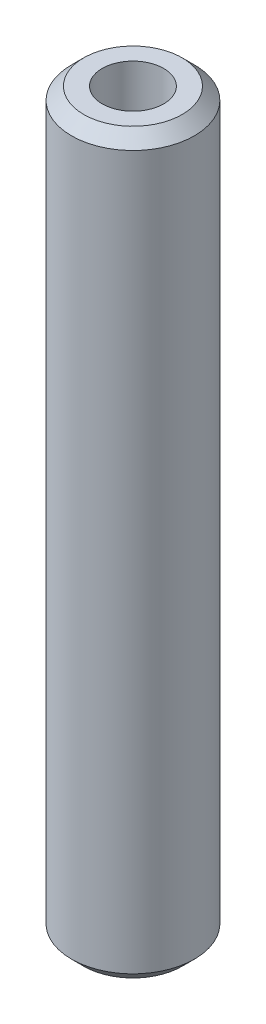
ISO-10303-21;
HEADER;
FILE_DESCRIPTION(('STEP AP214'),'2;1');
FILE_NAME('part.step','',(''),(''),'','','');
FILE_SCHEMA(('AUTOMOTIVE_DESIGN { 1 0 10303 214 1 1 1 1 }'));
ENDSEC;
DATA;
#1=APPLICATION_CONTEXT('core data for automotive mechanical design processes');
#2=APPLICATION_PROTOCOL_DEFINITION('international standard','automotive_design',2000,#1);
#3=PRODUCT_CONTEXT('',#1,'mechanical');
#4=PRODUCT('Part','Part','',(#3));
#5=PRODUCT_RELATED_PRODUCT_CATEGORY('part','',(#4));
#6=PRODUCT_DEFINITION_FORMATION('','',#4);
#7=PRODUCT_DEFINITION_CONTEXT('part definition',#1,'design');
#8=PRODUCT_DEFINITION('design','',#6,#7);
#9=PRODUCT_DEFINITION_SHAPE('','',#8);
#10=(LENGTH_UNIT() NAMED_UNIT(*) SI_UNIT(.MILLI.,.METRE.));
#11=(NAMED_UNIT(*) PLANE_ANGLE_UNIT() SI_UNIT($,.RADIAN.));
#12=(NAMED_UNIT(*) SI_UNIT($,.STERADIAN.) SOLID_ANGLE_UNIT());
#13=UNCERTAINTY_MEASURE_WITH_UNIT(LENGTH_MEASURE(1.E-05),#10,'distance_accuracy_value','');
#14=(GEOMETRIC_REPRESENTATION_CONTEXT(3) GLOBAL_UNCERTAINTY_ASSIGNED_CONTEXT((#13)) GLOBAL_UNIT_ASSIGNED_CONTEXT((#10,
#11,#12)) REPRESENTATION_CONTEXT('',''));
#15=CARTESIAN_POINT('',(0.,0.,0.));
#16=DIRECTION('',(0.,0.,1.));
#17=DIRECTION('',(1.,0.,0.));
#18=AXIS2_PLACEMENT_3D('',#15,#16,#17);
#19=CARTESIAN_POINT('',(0.,30.,0.));
#20=DIRECTION('',(0.,-1.,0.));
#21=DIRECTION('',(0.,0.,-1.));
#22=AXIS2_PLACEMENT_3D('',#19,#20,#21);
#23=CYLINDRICAL_SURFACE('',#22,2.5);
#24=CARTESIAN_POINT('',(0.,0.500000000000007,0.));
#25=DIRECTION('',(0.,1.,0.));
#26=DIRECTION('',(0.,0.,1.));
#27=AXIS2_PLACEMENT_3D('',#24,#25,#26);
#28=CIRCLE('',#27,2.5);
#29=CARTESIAN_POINT('',(0.,0.500000000000007,2.5));
#30=VERTEX_POINT('',#29);
#31=EDGE_CURVE('E92',#30,#30,#28,.T.);
#32=ORIENTED_EDGE('',*,*,#31,.T.);
#33=EDGE_LOOP('',(#32));
#34=FACE_BOUND('',#33,.T.);
#35=CARTESIAN_POINT('',(0.,29.5,0.));
#36=DIRECTION('',(0.,1.,0.));
#37=DIRECTION('',(0.,0.,1.));
#38=AXIS2_PLACEMENT_3D('',#35,#36,#37);
#39=CIRCLE('',#38,2.5);
#40=CARTESIAN_POINT('',(0.,29.5,2.5));
#41=VERTEX_POINT('',#40);
#42=EDGE_CURVE('E88',#41,#41,#39,.F.);
#43=ORIENTED_EDGE('',*,*,#42,.T.);
#44=EDGE_LOOP('',(#43));
#45=FACE_BOUND('',#44,.T.);
#46=ADVANCED_FACE('F47',(#34,#45),#23,.T.);
#47=CARTESIAN_POINT('',(0.,30.,0.));
#48=DIRECTION('',(0.,1.,0.));
#49=DIRECTION('',(0.,0.,1.));
#50=AXIS2_PLACEMENT_3D('',#47,#48,#49);
#51=PLANE('',#50);
#52=CARTESIAN_POINT('',(0.,30.,0.));
#53=DIRECTION('',(0.,1.,0.));
#54=DIRECTION('',(0.,0.,1.));
#55=AXIS2_PLACEMENT_3D('',#52,#53,#54);
#56=CIRCLE('',#55,1.99999999999999);
#57=CARTESIAN_POINT('',(0.,30.,1.99999999999999));
#58=VERTEX_POINT('',#57);
#59=EDGE_CURVE('E11',#58,#58,#56,.T.);
#60=ORIENTED_EDGE('',*,*,#59,.T.);
#61=EDGE_LOOP('',(#60));
#62=FACE_BOUND('',#61,.T.);
#63=CARTESIAN_POINT('',(0.,30.,0.));
#64=DIRECTION('',(0.,1.,0.));
#65=DIRECTION('',(0.,0.,1.));
#66=AXIS2_PLACEMENT_3D('',#63,#64,#65);
#67=CIRCLE('',#66,1.24999999999999);
#68=CARTESIAN_POINT('',(0.,30.,1.24999999999999));
#69=VERTEX_POINT('',#68);
#70=EDGE_CURVE('E74',#69,#69,#67,.T.);
#71=ORIENTED_EDGE('',*,*,#70,.F.);
#72=EDGE_LOOP('',(#71));
#73=FACE_BOUND('',#72,.T.);
#74=ADVANCED_FACE('F109',(#62,#73),#51,.T.);
#75=CARTESIAN_POINT('',(0.,0.,0.));
#76=DIRECTION('',(0.,1.,0.));
#77=DIRECTION('',(0.,0.,1.));
#78=AXIS2_PLACEMENT_3D('',#75,#76,#77);
#79=PLANE('',#78);
#80=CARTESIAN_POINT('',(0.,0.,0.));
#81=DIRECTION('',(0.,1.,0.));
#82=DIRECTION('',(0.,0.,1.));
#83=AXIS2_PLACEMENT_3D('',#80,#81,#82);
#84=CIRCLE('',#83,1.99999999999999);
#85=CARTESIAN_POINT('',(0.,0.,1.99999999999999));
#86=VERTEX_POINT('',#85);
#87=EDGE_CURVE('E57',#86,#86,#84,.F.);
#88=ORIENTED_EDGE('',*,*,#87,.T.);
#89=EDGE_LOOP('',(#88));
#90=FACE_BOUND('',#89,.T.);
#91=CARTESIAN_POINT('',(0.,0.,0.));
#92=DIRECTION('',(0.,-1.,0.));
#93=DIRECTION('',(0.,0.,-1.));
#94=AXIS2_PLACEMENT_3D('',#91,#92,#93);
#95=CIRCLE('',#94,1.24999999999999);
#96=CARTESIAN_POINT('',(0.,0.,-1.24999999999999));
#97=VERTEX_POINT('',#96);
#98=EDGE_CURVE('E75',#97,#97,#95,.T.);
#99=ORIENTED_EDGE('',*,*,#98,.F.);
#100=EDGE_LOOP('',(#99));
#101=FACE_BOUND('',#100,.T.);
#102=ADVANCED_FACE('F99',(#90,#101),#79,.F.);
#103=CARTESIAN_POINT('',(0.,23.,0.));
#104=DIRECTION('',(0.,1.,0.));
#105=DIRECTION('',(0.,0.,1.));
#106=AXIS2_PLACEMENT_3D('',#103,#104,#105);
#107=CONICAL_SURFACE('',#106,1.25,1.02974425867665);
#108=CARTESIAN_POINT('',(0.,22.2489242262155,0.));
#109=VERTEX_POINT('',#108);
#110=VERTEX_LOOP('',#109);
#111=FACE_BOUND('',#110,.T.);
#112=CARTESIAN_POINT('',(0.,23.,0.));
#113=DIRECTION('',(0.,1.,0.));
#114=DIRECTION('',(0.,0.,1.));
#115=AXIS2_PLACEMENT_3D('',#112,#113,#114);
#116=CIRCLE('',#115,1.25);
#117=CARTESIAN_POINT('',(0.,23.,1.25));
#118=VERTEX_POINT('',#117);
#119=EDGE_CURVE('E80',#118,#118,#116,.T.);
#120=ORIENTED_EDGE('',*,*,#119,.T.);
#121=EDGE_LOOP('',(#120));
#122=FACE_BOUND('',#121,.T.);
#123=ADVANCED_FACE('F123',(#111,#122),#107,.F.);
#124=CARTESIAN_POINT('',(0.,30.,0.));
#125=DIRECTION('',(0.,1.,0.));
#126=DIRECTION('',(0.,0.,1.));
#127=AXIS2_PLACEMENT_3D('',#124,#125,#126);
#128=CYLINDRICAL_SURFACE('',#127,1.24999999999999);
#129=ORIENTED_EDGE('',*,*,#119,.F.);
#130=EDGE_LOOP('',(#129));
#131=FACE_BOUND('',#130,.T.);
#132=ORIENTED_EDGE('',*,*,#70,.T.);
#133=EDGE_LOOP('',(#132));
#134=FACE_BOUND('',#133,.T.);
#135=ADVANCED_FACE('F67',(#131,#134),#128,.F.);
#136=CARTESIAN_POINT('',(0.,6.99999999999999,0.));
#137=DIRECTION('',(0.,-1.,0.));
#138=DIRECTION('',(0.,0.,-1.));
#139=AXIS2_PLACEMENT_3D('',#136,#137,#138);
#140=CONICAL_SURFACE('',#139,1.24999999999999,1.02974425867665);
#141=CARTESIAN_POINT('',(0.,7.75107577378444,0.));
#142=VERTEX_POINT('',#141);
#143=VERTEX_LOOP('',#142);
#144=FACE_BOUND('',#143,.T.);
#145=CARTESIAN_POINT('',(0.,6.99999999999999,0.));
#146=DIRECTION('',(0.,-1.,0.));
#147=DIRECTION('',(0.,0.,-1.));
#148=AXIS2_PLACEMENT_3D('',#145,#146,#147);
#149=CIRCLE('',#148,1.24999999999999);
#150=CARTESIAN_POINT('',(0.,6.99999999999999,-1.24999999999999));
#151=VERTEX_POINT('',#150);
#152=EDGE_CURVE('E71',#151,#151,#149,.T.);
#153=ORIENTED_EDGE('',*,*,#152,.T.);
#154=EDGE_LOOP('',(#153));
#155=FACE_BOUND('',#154,.T.);
#156=ADVANCED_FACE('F63',(#144,#155),#140,.F.);
#157=CARTESIAN_POINT('',(0.,0.,0.));
#158=DIRECTION('',(0.,-1.,0.));
#159=DIRECTION('',(0.,0.,-1.));
#160=AXIS2_PLACEMENT_3D('',#157,#158,#159);
#161=CYLINDRICAL_SURFACE('',#160,1.24999999999999);
#162=ORIENTED_EDGE('',*,*,#152,.F.);
#163=EDGE_LOOP('',(#162));
#164=FACE_BOUND('',#163,.T.);
#165=ORIENTED_EDGE('',*,*,#98,.T.);
#166=EDGE_LOOP('',(#165));
#167=FACE_BOUND('',#166,.T.);
#168=ADVANCED_FACE('F66',(#164,#167),#161,.F.);
#169=CARTESIAN_POINT('',(0.,0.500000000000007,0.));
#170=DIRECTION('',(0.,1.,0.));
#171=DIRECTION('',(0.,0.,1.));
#172=AXIS2_PLACEMENT_3D('',#169,#170,#171);
#173=CONICAL_SURFACE('',#172,2.5,0.785398163397446);
#174=ORIENTED_EDGE('',*,*,#87,.F.);
#175=EDGE_LOOP('',(#174));
#176=FACE_BOUND('',#175,.T.);
#177=ORIENTED_EDGE('',*,*,#31,.F.);
#178=EDGE_LOOP('',(#177));
#179=FACE_BOUND('',#178,.T.);
#180=ADVANCED_FACE('F102',(#176,#179),#173,.T.);
#181=CARTESIAN_POINT('',(0.,30.,0.));
#182=DIRECTION('',(0.,-1.,0.));
#183=DIRECTION('',(0.,0.,-1.));
#184=AXIS2_PLACEMENT_3D('',#181,#182,#183);
#185=CONICAL_SURFACE('',#184,1.99999999999999,0.785398163397449);
#186=ORIENTED_EDGE('',*,*,#42,.F.);
#187=EDGE_LOOP('',(#186));
#188=FACE_BOUND('',#187,.T.);
#189=ORIENTED_EDGE('',*,*,#59,.F.);
#190=EDGE_LOOP('',(#189));
#191=FACE_BOUND('',#190,.T.);
#192=ADVANCED_FACE('F50',(#188,#191),#185,.T.);
#193=CLOSED_SHELL('',(#46,#74,#102,#123,#135,#156,#168,#180,#192));
#194=MANIFOLD_SOLID_BREP('B2',#193);
#195=ADVANCED_BREP_SHAPE_REPRESENTATION('',(#18,#194),#14);
#196=SHAPE_DEFINITION_REPRESENTATION(#9,#195);
ENDSEC;
END-ISO-10303-21;
